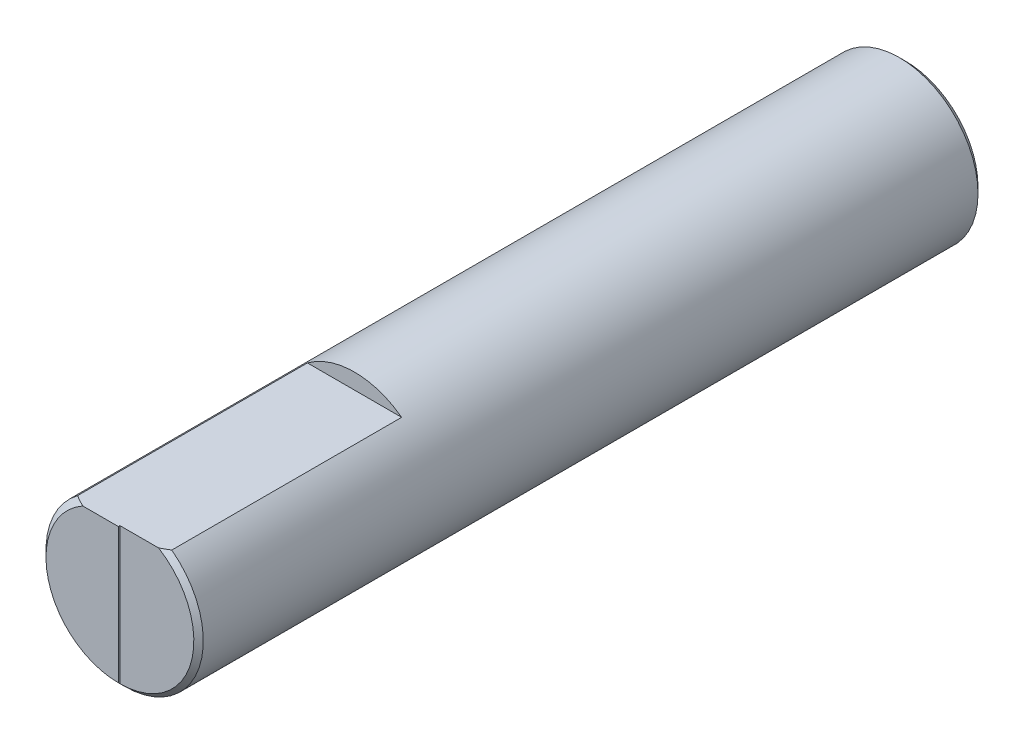
ISO-10303-21;
HEADER;
FILE_DESCRIPTION(('STEP AP214'),'2;1');
FILE_NAME('part.step','',(''),(''),'','','');
FILE_SCHEMA(('AUTOMOTIVE_DESIGN { 1 0 10303 214 1 1 1 1 }'));
ENDSEC;
DATA;
#1=APPLICATION_CONTEXT('core data for automotive mechanical design processes');
#2=APPLICATION_PROTOCOL_DEFINITION('international standard','automotive_design',2000,#1);
#3=PRODUCT_CONTEXT('',#1,'mechanical');
#4=PRODUCT('Part','Part','',(#3));
#5=PRODUCT_RELATED_PRODUCT_CATEGORY('part','',(#4));
#6=PRODUCT_DEFINITION_FORMATION('','',#4);
#7=PRODUCT_DEFINITION_CONTEXT('part definition',#1,'design');
#8=PRODUCT_DEFINITION('design','',#6,#7);
#9=PRODUCT_DEFINITION_SHAPE('','',#8);
#10=(LENGTH_UNIT() NAMED_UNIT(*) SI_UNIT(.MILLI.,.METRE.));
#11=(NAMED_UNIT(*) PLANE_ANGLE_UNIT() SI_UNIT($,.RADIAN.));
#12=(NAMED_UNIT(*) SI_UNIT($,.STERADIAN.) SOLID_ANGLE_UNIT());
#13=UNCERTAINTY_MEASURE_WITH_UNIT(LENGTH_MEASURE(1.E-05),#10,'distance_accuracy_value','');
#14=(GEOMETRIC_REPRESENTATION_CONTEXT(3) GLOBAL_UNCERTAINTY_ASSIGNED_CONTEXT((#13)) GLOBAL_UNIT_ASSIGNED_CONTEXT((#10,
#11,#12)) REPRESENTATION_CONTEXT('',''));
#15=CARTESIAN_POINT('',(0.,0.,0.));
#16=DIRECTION('',(0.,0.,1.));
#17=DIRECTION('',(1.,0.,0.));
#18=AXIS2_PLACEMENT_3D('',#15,#16,#17);
#19=CARTESIAN_POINT('',(0.,0.,63.5));
#20=DIRECTION('',(0.,0.,-1.));
#21=DIRECTION('',(-1.,0.,0.));
#22=AXIS2_PLACEMENT_3D('',#19,#20,#21);
#23=CYLINDRICAL_SURFACE('',#22,6.34365);
#24=CARTESIAN_POINT('',(0.,0.,0.508000000000008));
#25=DIRECTION('',(0.,0.,1.));
#26=DIRECTION('',(1.,0.,0.));
#27=AXIS2_PLACEMENT_3D('',#24,#25,#26);
#28=CIRCLE('',#27,6.34365);
#29=CARTESIAN_POINT('',(6.34365,0.,0.508000000000008));
#30=VERTEX_POINT('',#29);
#31=EDGE_CURVE('E110',#30,#30,#28,.T.);
#32=ORIENTED_EDGE('',*,*,#31,.T.);
#33=EDGE_LOOP('',(#32));
#34=FACE_BOUND('',#33,.T.);
#35=DIRECTION('',(0.,0.,-1.));
#36=VECTOR('',#35,1.);
#37=CARTESIAN_POINT('',(3.79940723304307,5.08,63.5));
#38=LINE('',#37,#36);
#39=CARTESIAN_POINT('',(3.79940723304307,5.08,44.45));
#40=VERTEX_POINT('',#39);
#41=CARTESIAN_POINT('',(3.79940723304307,5.08,62.992));
#42=VERTEX_POINT('',#41);
#43=EDGE_CURVE('E105',#40,#42,#38,.F.);
#44=ORIENTED_EDGE('',*,*,#43,.T.);
#45=CARTESIAN_POINT('',(0.,0.,62.992));
#46=DIRECTION('',(0.,0.,1.));
#47=DIRECTION('',(1.,0.,0.));
#48=AXIS2_PLACEMENT_3D('',#45,#46,#47);
#49=CIRCLE('',#48,6.34365);
#50=CARTESIAN_POINT('',(-3.79940723304307,5.08,62.992));
#51=VERTEX_POINT('',#50);
#52=EDGE_CURVE('E103',#42,#51,#49,.F.);
#53=ORIENTED_EDGE('',*,*,#52,.T.);
#54=DIRECTION('',(0.,0.,-1.));
#55=VECTOR('',#54,1.);
#56=CARTESIAN_POINT('',(-3.79940723304307,5.08,63.5));
#57=LINE('',#56,#55);
#58=CARTESIAN_POINT('',(-3.79940723304307,5.08,44.45));
#59=VERTEX_POINT('',#58);
#60=EDGE_CURVE('E100',#51,#59,#57,.T.);
#61=ORIENTED_EDGE('',*,*,#60,.T.);
#62=CARTESIAN_POINT('',(0.,0.,44.45));
#63=DIRECTION('',(0.,0.,1.));
#64=DIRECTION('',(1.,0.,0.));
#65=AXIS2_PLACEMENT_3D('',#62,#63,#64);
#66=CIRCLE('',#65,6.34365);
#67=EDGE_CURVE('E99',#40,#59,#66,.T.);
#68=ORIENTED_EDGE('',*,*,#67,.F.);
#69=EDGE_LOOP('',(#44,#53,#61,#68));
#70=FACE_BOUND('',#69,.T.);
#71=ADVANCED_FACE('F34',(#34,#70),#23,.T.);
#72=CARTESIAN_POINT('',(0.,0.,63.5));
#73=DIRECTION('',(0.,0.,1.));
#74=DIRECTION('',(1.,0.,0.));
#75=AXIS2_PLACEMENT_3D('',#72,#73,#74);
#76=PLANE('',#75);
#77=DIRECTION('',(0.,-1.,0.));
#78=VECTOR('',#77,1.);
#79=CARTESIAN_POINT('',(0.,-7.01161939668291,63.5));
#80=LINE('',#79,#78);
#81=CARTESIAN_POINT('',(0.,5.08,63.5));
#82=VERTEX_POINT('',#81);
#83=CARTESIAN_POINT('',(0.,-5.83565,63.5));
#84=VERTEX_POINT('',#83);
#85=EDGE_CURVE('E85',#82,#84,#80,.T.);
#86=ORIENTED_EDGE('',*,*,#85,.F.);
#87=DIRECTION('',(1.,0.,0.));
#88=VECTOR('',#87,1.);
#89=CARTESIAN_POINT('',(0.,5.08,63.5));
#90=LINE('',#89,#88);
#91=CARTESIAN_POINT('',(-2.87200468706093,5.08,63.5));
#92=VERTEX_POINT('',#91);
#93=EDGE_CURVE('E94',#92,#82,#90,.T.);
#94=ORIENTED_EDGE('',*,*,#93,.F.);
#95=CARTESIAN_POINT('',(0.,0.,63.5));
#96=DIRECTION('',(0.,0.,1.));
#97=DIRECTION('',(1.,0.,0.));
#98=AXIS2_PLACEMENT_3D('',#95,#96,#97);
#99=CIRCLE('',#98,5.83565);
#100=EDGE_CURVE('E96',#92,#84,#99,.T.);
#101=ORIENTED_EDGE('',*,*,#100,.T.);
#102=EDGE_LOOP('',(#86,#94,#101));
#103=FACE_BOUND('',#102,.T.);
#104=ADVANCED_FACE('F93',(#103),#76,.T.);
#105=CARTESIAN_POINT('',(0.,0.,0.));
#106=DIRECTION('',(0.,0.,1.));
#107=DIRECTION('',(1.,0.,0.));
#108=AXIS2_PLACEMENT_3D('',#105,#106,#107);
#109=PLANE('',#108);
#110=CARTESIAN_POINT('',(0.,0.,0.));
#111=DIRECTION('',(0.,0.,1.));
#112=DIRECTION('',(1.,0.,0.));
#113=AXIS2_PLACEMENT_3D('',#110,#111,#112);
#114=CIRCLE('',#113,5.83564999999998);
#115=CARTESIAN_POINT('',(5.83564999999998,0.,0.));
#116=VERTEX_POINT('',#115);
#117=EDGE_CURVE('E113',#116,#116,#114,.F.);
#118=ORIENTED_EDGE('',*,*,#117,.T.);
#119=EDGE_LOOP('',(#118));
#120=FACE_BOUND('',#119,.T.);
#121=ADVANCED_FACE('F136',(#120),#109,.F.);
#122=CARTESIAN_POINT('',(4.699,5.08,44.45));
#123=DIRECTION('',(0.,0.,1.));
#124=DIRECTION('',(1.,0.,0.));
#125=AXIS2_PLACEMENT_3D('',#122,#123,#124);
#126=PLANE('',#125);
#127=ORIENTED_EDGE('',*,*,#67,.T.);
#128=DIRECTION('',(1.,0.,0.));
#129=VECTOR('',#128,1.);
#130=CARTESIAN_POINT('',(-4.699,5.08,44.45));
#131=LINE('',#130,#129);
#132=EDGE_CURVE('E88',#59,#40,#131,.T.);
#133=ORIENTED_EDGE('',*,*,#132,.T.);
#134=EDGE_LOOP('',(#127,#133));
#135=FACE_BOUND('',#134,.T.);
#136=ADVANCED_FACE('F131',(#135),#126,.T.);
#137=CARTESIAN_POINT('',(-4.699,5.08,44.45));
#138=DIRECTION('',(0.,-1.,0.));
#139=DIRECTION('',(0.,0.,-1.));
#140=AXIS2_PLACEMENT_3D('',#137,#138,#139);
#141=PLANE('',#140);
#142=ORIENTED_EDGE('',*,*,#93,.T.);
#143=DIRECTION('',(0.,0.,-1.));
#144=VECTOR('',#143,1.);
#145=CARTESIAN_POINT('',(0.,5.08,44.45));
#146=LINE('',#145,#144);
#147=CARTESIAN_POINT('',(0.,5.08,63.373));
#148=VERTEX_POINT('',#147);
#149=EDGE_CURVE('E82',#82,#148,#146,.T.);
#150=ORIENTED_EDGE('',*,*,#149,.T.);
#151=DIRECTION('',(1.,0.,0.));
#152=VECTOR('',#151,1.);
#153=CARTESIAN_POINT('',(-4.699,5.08,63.373));
#154=LINE('',#153,#152);
#155=CARTESIAN_POINT('',(3.1219857498874,5.08,63.373));
#156=VERTEX_POINT('',#155);
#157=EDGE_CURVE('E89',#148,#156,#154,.T.);
#158=ORIENTED_EDGE('',*,*,#157,.T.);
#159=CARTESIAN_POINT('',(2.87200468706093,5.08,63.5));
#160=CARTESIAN_POINT('',(2.95110927659494,5.08,63.4610654355664));
#161=CARTESIAN_POINT('',(3.02972948950477,5.08,63.4211571671635));
#162=CARTESIAN_POINT('',(3.18601846463083,5.08,63.3395961370702));
#163=CARTESIAN_POINT('',(3.26368761343709,5.08,63.2979441168126));
#164=CARTESIAN_POINT('',(3.41815400059444,5.08,63.2130677552294));
#165=CARTESIAN_POINT('',(3.49495128699353,5.08,63.1698435011063));
#166=CARTESIAN_POINT('',(3.64776240704715,5.08,63.0819573592526));
#167=CARTESIAN_POINT('',(3.72377589726067,5.08,63.0372948739464));
#168=CARTESIAN_POINT('',(3.79940723304306,5.08,62.992));
#169=B_SPLINE_CURVE_WITH_KNOTS('',3,(#159,#160,#161,#162,#163,#164,#165,#166,#167,#168),
.UNSPECIFIED.,.F.,.F.,(4,2,2,2,4),(0.,0.264487962633816,0.528864586587433,0.793226569421491,
1.05769984733513),.UNSPECIFIED.);
#170=EDGE_CURVE('E122',#156,#42,#169,.T.);
#171=ORIENTED_EDGE('',*,*,#170,.T.);
#172=ORIENTED_EDGE('',*,*,#43,.F.);
#173=ORIENTED_EDGE('',*,*,#132,.F.);
#174=ORIENTED_EDGE('',*,*,#60,.F.);
#175=CARTESIAN_POINT('',(-3.79940723304307,5.08,62.992));
#176=CARTESIAN_POINT('',(-3.72377589726067,5.08,63.0372948739464));
#177=CARTESIAN_POINT('',(-3.64776240704715,5.08,63.0819573592526));
#178=CARTESIAN_POINT('',(-3.49495128699353,5.08,63.1698435011063));
#179=CARTESIAN_POINT('',(-3.41815400059444,5.08,63.2130677552294));
#180=CARTESIAN_POINT('',(-3.2636876134371,5.08,63.2979441168126));
#181=CARTESIAN_POINT('',(-3.18601846463083,5.08,63.3395961370702));
#182=CARTESIAN_POINT('',(-3.02972948950477,5.08,63.4211571671635));
#183=CARTESIAN_POINT('',(-2.95110927659494,5.08,63.4610654355664));
#184=CARTESIAN_POINT('',(-2.87200468706093,5.08,63.5));
#185=B_SPLINE_CURVE_WITH_KNOTS('',3,(#175,#176,#177,#178,#179,#180,#181,#182,#183,#184),
.UNSPECIFIED.,.F.,.F.,(4,2,2,2,4),(0.,0.264473277913643,0.528835260747703,0.793211884701322,
1.05769984733514),.UNSPECIFIED.);
#186=EDGE_CURVE('E57',#51,#92,#185,.T.);
#187=ORIENTED_EDGE('',*,*,#186,.T.);
#188=EDGE_LOOP('',(#142,#150,#158,#171,#172,#173,#174,#187));
#189=FACE_BOUND('',#188,.T.);
#190=ADVANCED_FACE('F98',(#189),#141,.F.);
#191=CARTESIAN_POINT('',(0.,0.,0.508000000000008));
#192=DIRECTION('',(0.,0.,1.));
#193=DIRECTION('',(1.,0.,0.));
#194=AXIS2_PLACEMENT_3D('',#191,#192,#193);
#195=CONICAL_SURFACE('',#194,6.34365,0.785398163397455);
#196=ORIENTED_EDGE('',*,*,#117,.F.);
#197=EDGE_LOOP('',(#196));
#198=FACE_BOUND('',#197,.T.);
#199=ORIENTED_EDGE('',*,*,#31,.F.);
#200=EDGE_LOOP('',(#199));
#201=FACE_BOUND('',#200,.T.);
#202=ADVANCED_FACE('F130',(#198,#201),#195,.T.);
#203=CARTESIAN_POINT('',(0.,0.,63.5));
#204=DIRECTION('',(0.,0.,-1.));
#205=DIRECTION('',(-1.,0.,0.));
#206=AXIS2_PLACEMENT_3D('',#203,#204,#205);
#207=CONICAL_SURFACE('',#206,5.83565,0.785398163397455);
#208=DIRECTION('',(0.,0.707106781186552,0.707106781186543));
#209=VECTOR('',#208,1.);
#210=CARTESIAN_POINT('',(0.,0.,69.3356499999999));
#211=LINE('',#210,#209);
#212=CARTESIAN_POINT('',(0.,-5.96265,63.373));
#213=VERTEX_POINT('',#212);
#214=EDGE_CURVE('E11',#84,#213,#211,.F.);
#215=ORIENTED_EDGE('',*,*,#214,.F.);
#216=ORIENTED_EDGE('',*,*,#100,.F.);
#217=ORIENTED_EDGE('',*,*,#186,.F.);
#218=ORIENTED_EDGE('',*,*,#52,.F.);
#219=ORIENTED_EDGE('',*,*,#170,.F.);
#220=CARTESIAN_POINT('',(0.,0.,63.373));
#221=DIRECTION('',(0.,0.,-1.));
#222=DIRECTION('',(-1.,0.,0.));
#223=AXIS2_PLACEMENT_3D('',#220,#221,#222);
#224=CIRCLE('',#223,5.96265);
#225=EDGE_CURVE('E43',#213,#156,#224,.F.);
#226=ORIENTED_EDGE('',*,*,#225,.F.);
#227=EDGE_LOOP('',(#215,#216,#217,#218,#219,#226));
#228=FACE_BOUND('',#227,.T.);
#229=ADVANCED_FACE('F36',(#228),#207,.T.);
#230=CARTESIAN_POINT('',(0.,-7.01161939668291,63.373));
#231=DIRECTION('',(-1.,0.,0.));
#232=DIRECTION('',(0.,0.,1.));
#233=AXIS2_PLACEMENT_3D('',#230,#231,#232);
#234=PLANE('',#233);
#235=ORIENTED_EDGE('',*,*,#85,.T.);
#236=ORIENTED_EDGE('',*,*,#214,.T.);
#237=DIRECTION('',(0.,-1.,0.));
#238=VECTOR('',#237,1.);
#239=CARTESIAN_POINT('',(0.,-7.01161939668291,63.373));
#240=LINE('',#239,#238);
#241=EDGE_CURVE('E50',#148,#213,#240,.T.);
#242=ORIENTED_EDGE('',*,*,#241,.F.);
#243=ORIENTED_EDGE('',*,*,#149,.F.);
#244=EDGE_LOOP('',(#235,#236,#242,#243));
#245=FACE_BOUND('',#244,.T.);
#246=ADVANCED_FACE('F84',(#245),#234,.F.);
#247=CARTESIAN_POINT('',(0.,-7.01161939668291,63.373));
#248=DIRECTION('',(0.,0.,-1.));
#249=DIRECTION('',(-1.,0.,0.));
#250=AXIS2_PLACEMENT_3D('',#247,#248,#249);
#251=PLANE('',#250);
#252=ORIENTED_EDGE('',*,*,#241,.T.);
#253=ORIENTED_EDGE('',*,*,#225,.T.);
#254=ORIENTED_EDGE('',*,*,#157,.F.);
#255=EDGE_LOOP('',(#252,#253,#254));
#256=FACE_BOUND('',#255,.T.);
#257=ADVANCED_FACE('F193',(#256),#251,.F.);
#258=CLOSED_SHELL('',(#71,#104,#121,#136,#190,#202,#229,#246,#257));
#259=MANIFOLD_SOLID_BREP('B2',#258);
#260=ADVANCED_BREP_SHAPE_REPRESENTATION('',(#18,#259),#14);
#261=SHAPE_DEFINITION_REPRESENTATION(#9,#260);
ENDSEC;
END-ISO-10303-21;
